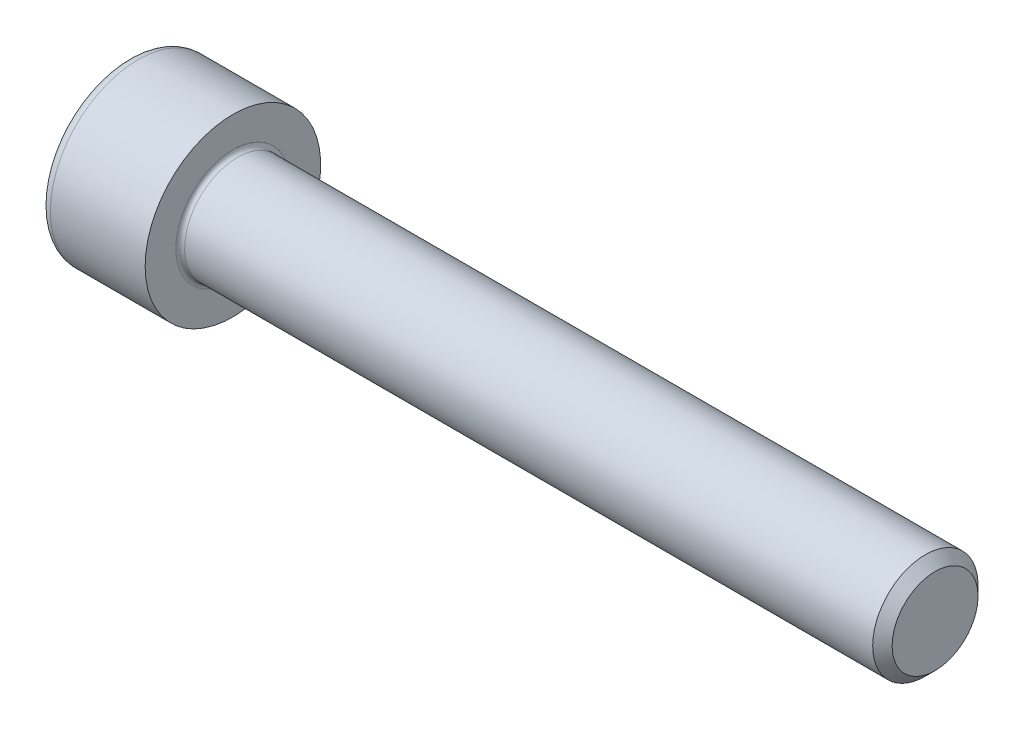
ISO-10303-21;
HEADER;
FILE_DESCRIPTION(('STEP AP214'),'2;1');
FILE_NAME('part.step','',(''),(''),'','','');
FILE_SCHEMA(('AUTOMOTIVE_DESIGN { 1 0 10303 214 1 1 1 1 }'));
ENDSEC;
DATA;
#1=APPLICATION_CONTEXT('core data for automotive mechanical design processes');
#2=APPLICATION_PROTOCOL_DEFINITION('international standard','automotive_design',2000,#1);
#3=PRODUCT_CONTEXT('',#1,'mechanical');
#4=PRODUCT('Part','Part','',(#3));
#5=PRODUCT_RELATED_PRODUCT_CATEGORY('part','',(#4));
#6=PRODUCT_DEFINITION_FORMATION('','',#4);
#7=PRODUCT_DEFINITION_CONTEXT('part definition',#1,'design');
#8=PRODUCT_DEFINITION('design','',#6,#7);
#9=PRODUCT_DEFINITION_SHAPE('','',#8);
#10=(LENGTH_UNIT() NAMED_UNIT(*) SI_UNIT(.MILLI.,.METRE.));
#11=(NAMED_UNIT(*) PLANE_ANGLE_UNIT() SI_UNIT($,.RADIAN.));
#12=(NAMED_UNIT(*) SI_UNIT($,.STERADIAN.) SOLID_ANGLE_UNIT());
#13=UNCERTAINTY_MEASURE_WITH_UNIT(LENGTH_MEASURE(1.E-05),#10,'distance_accuracy_value','');
#14=(GEOMETRIC_REPRESENTATION_CONTEXT(3) GLOBAL_UNCERTAINTY_ASSIGNED_CONTEXT((#13)) GLOBAL_UNIT_ASSIGNED_CONTEXT((#10,
#11,#12)) REPRESENTATION_CONTEXT('',''));
#15=CARTESIAN_POINT('',(0.,0.,0.));
#16=DIRECTION('',(0.,0.,1.));
#17=DIRECTION('',(1.,0.,0.));
#18=AXIS2_PLACEMENT_3D('',#15,#16,#17);
#19=CARTESIAN_POINT('',(0.,0.,0.));
#20=DIRECTION('',(-1.,0.,0.));
#21=DIRECTION('',(0.,0.,1.));
#22=AXIS2_PLACEMENT_3D('',#19,#20,#21);
#23=PLANE('',#22);
#24=DIRECTION('',(0.,-0.499999999999999,0.866025403784439));
#25=VECTOR('',#24,1.);
#26=CARTESIAN_POINT('',(0.,2.89829835133192,0.));
#27=LINE('',#26,#25);
#28=CARTESIAN_POINT('',(0.,2.89829835133192,0.));
#29=VERTEX_POINT('',#28);
#30=CARTESIAN_POINT('',(0.,1.44914917566596,2.50999999999999));
#31=VERTEX_POINT('',#30);
#32=EDGE_CURVE('E259',#29,#31,#27,.T.);
#33=ORIENTED_EDGE('',*,*,#32,.T.);
#34=DIRECTION('',(0.,1.,0.));
#35=VECTOR('',#34,1.);
#36=CARTESIAN_POINT('',(0.,-1.44914917566596,2.51));
#37=LINE('',#36,#35);
#38=CARTESIAN_POINT('',(0.,-1.44914917566596,2.51));
#39=VERTEX_POINT('',#38);
#40=EDGE_CURVE('E131',#39,#31,#37,.T.);
#41=ORIENTED_EDGE('',*,*,#40,.F.);
#42=DIRECTION('',(0.,-0.500000000000001,-0.866025403784438));
#43=VECTOR('',#42,1.);
#44=CARTESIAN_POINT('',(0.,-1.44914917566596,2.51));
#45=LINE('',#44,#43);
#46=CARTESIAN_POINT('',(0.,-2.89829835133192,0.));
#47=VERTEX_POINT('',#46);
#48=EDGE_CURVE('E262',#39,#47,#45,.T.);
#49=ORIENTED_EDGE('',*,*,#48,.T.);
#50=DIRECTION('',(0.,0.499999999999999,-0.866025403784439));
#51=VECTOR('',#50,1.);
#52=CARTESIAN_POINT('',(0.,-2.89829835133192,0.));
#53=LINE('',#52,#51);
#54=CARTESIAN_POINT('',(0.,-1.44914917566597,-2.51));
#55=VERTEX_POINT('',#54);
#56=EDGE_CURVE('E265',#47,#55,#53,.T.);
#57=ORIENTED_EDGE('',*,*,#56,.T.);
#58=DIRECTION('',(0.,-1.,0.));
#59=VECTOR('',#58,1.);
#60=CARTESIAN_POINT('',(0.,1.44914917566595,-2.51));
#61=LINE('',#60,#59);
#62=CARTESIAN_POINT('',(0.,1.44914917566595,-2.51));
#63=VERTEX_POINT('',#62);
#64=EDGE_CURVE('E268',#63,#55,#61,.T.);
#65=ORIENTED_EDGE('',*,*,#64,.F.);
#66=DIRECTION('',(0.,-0.500000000000002,-0.866025403784438));
#67=VECTOR('',#66,1.);
#68=CARTESIAN_POINT('',(0.,2.89829835133192,0.));
#69=LINE('',#68,#67);
#70=EDGE_CURVE('E126',#29,#63,#69,.T.);
#71=ORIENTED_EDGE('',*,*,#70,.F.);
#72=EDGE_LOOP('',(#33,#41,#49,#57,#65,#71));
#73=FACE_BOUND('',#72,.T.);
#74=CARTESIAN_POINT('',(0.,0.,0.));
#75=DIRECTION('',(-1.,0.,0.));
#76=DIRECTION('',(0.,0.,1.));
#77=AXIS2_PLACEMENT_3D('',#74,#75,#76);
#78=CIRCLE('',#77,4.4);
#79=CARTESIAN_POINT('',(0.,0.,4.4));
#80=VERTEX_POINT('',#79);
#81=EDGE_CURVE('E43',#80,#80,#78,.T.);
#82=ORIENTED_EDGE('',*,*,#81,.T.);
#83=EDGE_LOOP('',(#82));
#84=FACE_BOUND('',#83,.T.);
#85=ADVANCED_FACE('F35',(#73,#84),#23,.T.);
#86=CARTESIAN_POINT('',(-31.75,0.,0.));
#87=DIRECTION('',(-1.,0.,0.));
#88=DIRECTION('',(0.,0.,1.));
#89=AXIS2_PLACEMENT_3D('',#86,#87,#88);
#90=CYLINDRICAL_SURFACE('',#89,5.);
#91=CARTESIAN_POINT('',(0.600000000000003,0.,0.));
#92=DIRECTION('',(-1.,0.,0.));
#93=DIRECTION('',(0.,0.,1.));
#94=AXIS2_PLACEMENT_3D('',#91,#92,#93);
#95=CIRCLE('',#94,5.);
#96=CARTESIAN_POINT('',(0.600000000000003,0.,5.));
#97=VERTEX_POINT('',#96);
#98=EDGE_CURVE('E11',#97,#97,#95,.F.);
#99=ORIENTED_EDGE('',*,*,#98,.T.);
#100=EDGE_LOOP('',(#99));
#101=FACE_BOUND('',#100,.T.);
#102=CARTESIAN_POINT('',(6.,0.,0.));
#103=DIRECTION('',(-1.,0.,0.));
#104=DIRECTION('',(0.,0.,1.));
#105=AXIS2_PLACEMENT_3D('',#102,#103,#104);
#106=CIRCLE('',#105,5.);
#107=CARTESIAN_POINT('',(6.,0.,5.));
#108=VERTEX_POINT('',#107);
#109=EDGE_CURVE('E149',#108,#108,#106,.T.);
#110=ORIENTED_EDGE('',*,*,#109,.T.);
#111=EDGE_LOOP('',(#110));
#112=FACE_BOUND('',#111,.T.);
#113=ADVANCED_FACE('F173',(#101,#112),#90,.T.);
#114=CARTESIAN_POINT('',(6.,5.,0.));
#115=DIRECTION('',(1.,0.,0.));
#116=DIRECTION('',(0.,0.,-1.));
#117=AXIS2_PLACEMENT_3D('',#114,#115,#116);
#118=PLANE('',#117);
#119=CARTESIAN_POINT('',(6.,0.,0.));
#120=DIRECTION('',(1.,0.,0.));
#121=DIRECTION('',(0.,0.,-1.));
#122=AXIS2_PLACEMENT_3D('',#119,#120,#121);
#123=CIRCLE('',#122,3.24999999999999);
#124=CARTESIAN_POINT('',(6.,0.,-3.24999999999999));
#125=VERTEX_POINT('',#124);
#126=EDGE_CURVE('E152',#125,#125,#123,.F.);
#127=ORIENTED_EDGE('',*,*,#126,.T.);
#128=EDGE_LOOP('',(#127));
#129=FACE_BOUND('',#128,.T.);
#130=ORIENTED_EDGE('',*,*,#109,.F.);
#131=EDGE_LOOP('',(#130));
#132=FACE_BOUND('',#131,.T.);
#133=ADVANCED_FACE('F179',(#129,#132),#118,.T.);
#134=CARTESIAN_POINT('',(-31.75,0.,0.));
#135=DIRECTION('',(-1.,0.,0.));
#136=DIRECTION('',(0.,0.,1.));
#137=AXIS2_PLACEMENT_3D('',#134,#135,#136);
#138=CYLINDRICAL_SURFACE('',#137,2.99999999999999);
#139=CARTESIAN_POINT('',(6.25,0.,0.));
#140=DIRECTION('',(1.,0.,0.));
#141=DIRECTION('',(0.,0.,-1.));
#142=AXIS2_PLACEMENT_3D('',#139,#140,#141);
#143=CIRCLE('',#142,2.99999999999999);
#144=CARTESIAN_POINT('',(6.25,0.,-2.99999999999999));
#145=VERTEX_POINT('',#144);
#146=EDGE_CURVE('E155',#145,#145,#143,.T.);
#147=ORIENTED_EDGE('',*,*,#146,.T.);
#148=EDGE_LOOP('',(#147));
#149=FACE_BOUND('',#148,.T.);
#150=CARTESIAN_POINT('',(45.4455,0.,0.));
#151=DIRECTION('',(-1.,0.,0.));
#152=DIRECTION('',(0.,0.,1.));
#153=AXIS2_PLACEMENT_3D('',#150,#151,#152);
#154=CIRCLE('',#153,2.99999999999998);
#155=CARTESIAN_POINT('',(45.4455,0.,2.99999999999998));
#156=VERTEX_POINT('',#155);
#157=EDGE_CURVE('E146',#156,#156,#154,.T.);
#158=ORIENTED_EDGE('',*,*,#157,.T.);
#159=EDGE_LOOP('',(#158));
#160=FACE_BOUND('',#159,.T.);
#161=ADVANCED_FACE('F185',(#149,#160),#138,.T.);
#162=CARTESIAN_POINT('',(46.,0.,0.));
#163=DIRECTION('',(-1.,0.,0.));
#164=DIRECTION('',(0.,0.,1.));
#165=AXIS2_PLACEMENT_3D('',#162,#163,#164);
#166=CONICAL_SURFACE('',#165,2.4455,0.785398163397417);
#167=ORIENTED_EDGE('',*,*,#157,.F.);
#168=EDGE_LOOP('',(#167));
#169=FACE_BOUND('',#168,.T.);
#170=CARTESIAN_POINT('',(46.,0.,0.));
#171=DIRECTION('',(-1.,0.,0.));
#172=DIRECTION('',(0.,0.,1.));
#173=AXIS2_PLACEMENT_3D('',#170,#171,#172);
#174=CIRCLE('',#173,2.4455);
#175=CARTESIAN_POINT('',(46.,0.,2.4455));
#176=VERTEX_POINT('',#175);
#177=EDGE_CURVE('E142',#176,#176,#174,.T.);
#178=ORIENTED_EDGE('',*,*,#177,.T.);
#179=EDGE_LOOP('',(#178));
#180=FACE_BOUND('',#179,.T.);
#181=ADVANCED_FACE('F189',(#169,#180),#166,.T.);
#182=CARTESIAN_POINT('',(46.,2.4455,0.));
#183=DIRECTION('',(1.,0.,0.));
#184=DIRECTION('',(0.,0.,-1.));
#185=AXIS2_PLACEMENT_3D('',#182,#183,#184);
#186=PLANE('',#185);
#187=ORIENTED_EDGE('',*,*,#177,.F.);
#188=EDGE_LOOP('',(#187));
#189=FACE_BOUND('',#188,.T.);
#190=ADVANCED_FACE('F169',(#189),#186,.T.);
#191=CARTESIAN_POINT('',(6.25,0.,0.));
#192=DIRECTION('',(1.,0.,0.));
#193=DIRECTION('',(0.,0.,-1.));
#194=AXIS2_PLACEMENT_3D('',#191,#192,#193);
#195=TOROIDAL_SURFACE('',#194,3.24999999999999,0.25);
#196=ORIENTED_EDGE('',*,*,#146,.F.);
#197=EDGE_LOOP('',(#196));
#198=FACE_BOUND('',#197,.T.);
#199=ORIENTED_EDGE('',*,*,#126,.F.);
#200=EDGE_LOOP('',(#199));
#201=FACE_BOUND('',#200,.T.);
#202=ADVANCED_FACE('F162',(#198,#201),#195,.F.);
#203=CARTESIAN_POINT('',(0.600000000000003,0.,0.));
#204=DIRECTION('',(-1.,0.,0.));
#205=DIRECTION('',(0.,0.,1.));
#206=AXIS2_PLACEMENT_3D('',#203,#204,#205);
#207=TOROIDAL_SURFACE('',#206,4.4,0.6);
#208=ORIENTED_EDGE('',*,*,#98,.F.);
#209=EDGE_LOOP('',(#208));
#210=FACE_BOUND('',#209,.T.);
#211=ORIENTED_EDGE('',*,*,#81,.F.);
#212=EDGE_LOOP('',(#211));
#213=FACE_BOUND('',#212,.T.);
#214=ADVANCED_FACE('F37',(#210,#213),#207,.T.);
#215=CARTESIAN_POINT('',(3.,2.89829835133192,0.));
#216=DIRECTION('',(0.,-0.866025403784439,-0.499999999999999));
#217=DIRECTION('',(0.,0.499999999999999,-0.866025403784439));
#218=AXIS2_PLACEMENT_3D('',#215,#216,#217);
#219=PLANE('',#218);
#220=ORIENTED_EDGE('',*,*,#32,.F.);
#221=DIRECTION('',(-1.,0.,0.));
#222=VECTOR('',#221,1.);
#223=CARTESIAN_POINT('',(3.,2.89829835133192,0.));
#224=LINE('',#223,#222);
#225=CARTESIAN_POINT('',(3.,2.89829835133192,0.));
#226=VERTEX_POINT('',#225);
#227=EDGE_CURVE('E249',#226,#29,#224,.T.);
#228=ORIENTED_EDGE('',*,*,#227,.F.);
#229=DIRECTION('',(0.,-0.499999999999999,0.866025403784439));
#230=VECTOR('',#229,1.);
#231=CARTESIAN_POINT('',(3.,2.89829835133192,0.));
#232=LINE('',#231,#230);
#233=CARTESIAN_POINT('',(3.,2.17372376349894,1.25499999999999));
#234=VERTEX_POINT('',#233);
#235=EDGE_CURVE('E118',#226,#234,#232,.T.);
#236=ORIENTED_EDGE('',*,*,#235,.T.);
#237=CARTESIAN_POINT('',(3.,1.44914917566596,2.50999999999999));
#238=VERTEX_POINT('',#237);
#239=EDGE_CURVE('E109',#234,#238,#232,.T.);
#240=ORIENTED_EDGE('',*,*,#239,.T.);
#241=DIRECTION('',(-1.,0.,0.));
#242=VECTOR('',#241,1.);
#243=CARTESIAN_POINT('',(3.,1.44914917566596,2.50999999999999));
#244=LINE('',#243,#242);
#245=EDGE_CURVE('E123',#238,#31,#244,.T.);
#246=ORIENTED_EDGE('',*,*,#245,.T.);
#247=EDGE_LOOP('',(#220,#228,#236,#240,#246));
#248=FACE_BOUND('',#247,.T.);
#249=ADVANCED_FACE('F122',(#248),#219,.T.);
#250=CARTESIAN_POINT('',(3.,-1.44914917566596,2.51));
#251=DIRECTION('',(0.,0.,1.));
#252=DIRECTION('',(0.,-1.,0.));
#253=AXIS2_PLACEMENT_3D('',#250,#251,#252);
#254=PLANE('',#253);
#255=ORIENTED_EDGE('',*,*,#40,.T.);
#256=ORIENTED_EDGE('',*,*,#245,.F.);
#257=DIRECTION('',(0.,1.,0.));
#258=VECTOR('',#257,1.);
#259=CARTESIAN_POINT('',(3.,-1.44914917566596,2.51));
#260=LINE('',#259,#258);
#261=CARTESIAN_POINT('',(3.,0.,2.51));
#262=VERTEX_POINT('',#261);
#263=EDGE_CURVE('E106',#262,#238,#260,.T.);
#264=ORIENTED_EDGE('',*,*,#263,.F.);
#265=CARTESIAN_POINT('',(3.,-1.44914917566596,2.51));
#266=VERTEX_POINT('',#265);
#267=EDGE_CURVE('E117',#266,#262,#260,.T.);
#268=ORIENTED_EDGE('',*,*,#267,.F.);
#269=DIRECTION('',(-1.,0.,0.));
#270=VECTOR('',#269,1.);
#271=CARTESIAN_POINT('',(3.,-1.44914917566596,2.51));
#272=LINE('',#271,#270);
#273=EDGE_CURVE('E133',#266,#39,#272,.T.);
#274=ORIENTED_EDGE('',*,*,#273,.T.);
#275=EDGE_LOOP('',(#255,#256,#264,#268,#274));
#276=FACE_BOUND('',#275,.T.);
#277=ADVANCED_FACE('F128',(#276),#254,.F.);
#278=CARTESIAN_POINT('',(3.,-1.44914917566596,2.51));
#279=DIRECTION('',(0.,0.866025403784438,-0.500000000000001));
#280=DIRECTION('',(0.,0.500000000000001,0.866025403784438));
#281=AXIS2_PLACEMENT_3D('',#278,#279,#280);
#282=PLANE('',#281);
#283=ORIENTED_EDGE('',*,*,#48,.F.);
#284=ORIENTED_EDGE('',*,*,#273,.F.);
#285=DIRECTION('',(0.,-0.500000000000001,-0.866025403784438));
#286=VECTOR('',#285,1.);
#287=CARTESIAN_POINT('',(3.,-1.44914917566596,2.51));
#288=LINE('',#287,#286);
#289=CARTESIAN_POINT('',(3.,-2.17372376349894,1.255));
#290=VERTEX_POINT('',#289);
#291=EDGE_CURVE('E288',#266,#290,#288,.T.);
#292=ORIENTED_EDGE('',*,*,#291,.T.);
#293=CARTESIAN_POINT('',(3.,-2.89829835133192,0.));
#294=VERTEX_POINT('',#293);
#295=EDGE_CURVE('E277',#290,#294,#288,.T.);
#296=ORIENTED_EDGE('',*,*,#295,.T.);
#297=DIRECTION('',(-1.,0.,0.));
#298=VECTOR('',#297,1.);
#299=CARTESIAN_POINT('',(3.,-2.89829835133192,0.));
#300=LINE('',#299,#298);
#301=EDGE_CURVE('E138',#294,#47,#300,.T.);
#302=ORIENTED_EDGE('',*,*,#301,.T.);
#303=EDGE_LOOP('',(#283,#284,#292,#296,#302));
#304=FACE_BOUND('',#303,.T.);
#305=ADVANCED_FACE('F203',(#304),#282,.T.);
#306=CARTESIAN_POINT('',(3.,-2.89829835133192,0.));
#307=DIRECTION('',(0.,0.866025403784439,0.499999999999999));
#308=DIRECTION('',(0.,-0.499999999999999,0.866025403784439));
#309=AXIS2_PLACEMENT_3D('',#306,#307,#308);
#310=PLANE('',#309);
#311=ORIENTED_EDGE('',*,*,#56,.F.);
#312=ORIENTED_EDGE('',*,*,#301,.F.);
#313=DIRECTION('',(0.,0.499999999999999,-0.866025403784439));
#314=VECTOR('',#313,1.);
#315=CARTESIAN_POINT('',(3.,-2.89829835133192,0.));
#316=LINE('',#315,#314);
#317=CARTESIAN_POINT('',(3.,-2.17372376349895,-1.255));
#318=VERTEX_POINT('',#317);
#319=EDGE_CURVE('E255',#294,#318,#316,.T.);
#320=ORIENTED_EDGE('',*,*,#319,.T.);
#321=CARTESIAN_POINT('',(3.,-1.44914917566597,-2.51));
#322=VERTEX_POINT('',#321);
#323=EDGE_CURVE('E287',#318,#322,#316,.T.);
#324=ORIENTED_EDGE('',*,*,#323,.T.);
#325=DIRECTION('',(-1.,0.,0.));
#326=VECTOR('',#325,1.);
#327=CARTESIAN_POINT('',(3.,-1.44914917566597,-2.51));
#328=LINE('',#327,#326);
#329=EDGE_CURVE('E248',#322,#55,#328,.T.);
#330=ORIENTED_EDGE('',*,*,#329,.T.);
#331=EDGE_LOOP('',(#311,#312,#320,#324,#330));
#332=FACE_BOUND('',#331,.T.);
#333=ADVANCED_FACE('F206',(#332),#310,.T.);
#334=CARTESIAN_POINT('',(3.,1.44914917566595,-2.51));
#335=DIRECTION('',(0.,0.,-1.));
#336=DIRECTION('',(0.,1.,0.));
#337=AXIS2_PLACEMENT_3D('',#334,#335,#336);
#338=PLANE('',#337);
#339=ORIENTED_EDGE('',*,*,#64,.T.);
#340=ORIENTED_EDGE('',*,*,#329,.F.);
#341=DIRECTION('',(0.,-1.,0.));
#342=VECTOR('',#341,1.);
#343=CARTESIAN_POINT('',(3.,1.44914917566595,-2.51));
#344=LINE('',#343,#342);
#345=CARTESIAN_POINT('',(3.,0.,-2.51));
#346=VERTEX_POINT('',#345);
#347=EDGE_CURVE('E252',#346,#322,#344,.T.);
#348=ORIENTED_EDGE('',*,*,#347,.F.);
#349=CARTESIAN_POINT('',(3.,1.44914917566595,-2.51));
#350=VERTEX_POINT('',#349);
#351=EDGE_CURVE('E50',#350,#346,#344,.T.);
#352=ORIENTED_EDGE('',*,*,#351,.F.);
#353=DIRECTION('',(-1.,0.,0.));
#354=VECTOR('',#353,1.);
#355=CARTESIAN_POINT('',(3.,1.44914917566595,-2.51));
#356=LINE('',#355,#354);
#357=EDGE_CURVE('E245',#350,#63,#356,.T.);
#358=ORIENTED_EDGE('',*,*,#357,.T.);
#359=EDGE_LOOP('',(#339,#340,#348,#352,#358));
#360=FACE_BOUND('',#359,.T.);
#361=ADVANCED_FACE('F210',(#360),#338,.F.);
#362=CARTESIAN_POINT('',(3.,2.89829835133192,0.));
#363=DIRECTION('',(0.,0.866025403784438,-0.500000000000002));
#364=DIRECTION('',(0.,0.500000000000002,0.866025403784438));
#365=AXIS2_PLACEMENT_3D('',#362,#363,#364);
#366=PLANE('',#365);
#367=ORIENTED_EDGE('',*,*,#70,.T.);
#368=ORIENTED_EDGE('',*,*,#357,.F.);
#369=DIRECTION('',(0.,-0.500000000000002,-0.866025403784438));
#370=VECTOR('',#369,1.);
#371=CARTESIAN_POINT('',(3.,2.89829835133192,0.));
#372=LINE('',#371,#370);
#373=CARTESIAN_POINT('',(3.,2.17372376349894,-1.255));
#374=VERTEX_POINT('',#373);
#375=EDGE_CURVE('E235',#374,#350,#372,.T.);
#376=ORIENTED_EDGE('',*,*,#375,.F.);
#377=EDGE_CURVE('E241',#226,#374,#372,.T.);
#378=ORIENTED_EDGE('',*,*,#377,.F.);
#379=ORIENTED_EDGE('',*,*,#227,.T.);
#380=EDGE_LOOP('',(#367,#368,#376,#378,#379));
#381=FACE_BOUND('',#380,.T.);
#382=ADVANCED_FACE('F214',(#381),#366,.F.);
#383=CARTESIAN_POINT('',(3.,2.89829835133192,0.));
#384=DIRECTION('',(1.,0.,0.));
#385=DIRECTION('',(0.,0.,-1.));
#386=AXIS2_PLACEMENT_3D('',#383,#384,#385);
#387=PLANE('',#386);
#388=ORIENTED_EDGE('',*,*,#347,.T.);
#389=ORIENTED_EDGE('',*,*,#323,.F.);
#390=CARTESIAN_POINT('',(3.,0.,0.));
#391=DIRECTION('',(-1.,0.,0.));
#392=DIRECTION('',(0.,0.,1.));
#393=AXIS2_PLACEMENT_3D('',#390,#391,#392);
#394=CIRCLE('',#393,2.51);
#395=EDGE_CURVE('E283',#346,#318,#394,.T.);
#396=ORIENTED_EDGE('',*,*,#395,.F.);
#397=EDGE_LOOP('',(#388,#389,#396));
#398=FACE_BOUND('',#397,.T.);
#399=ADVANCED_FACE('F218',(#398),#387,.F.);
#400=ORIENTED_EDGE('',*,*,#319,.F.);
#401=ORIENTED_EDGE('',*,*,#295,.F.);
#402=EDGE_CURVE('E136',#318,#290,#394,.T.);
#403=ORIENTED_EDGE('',*,*,#402,.F.);
#404=EDGE_LOOP('',(#400,#401,#403));
#405=FACE_BOUND('',#404,.T.);
#406=ADVANCED_FACE('F221',(#405),#387,.F.);
#407=ORIENTED_EDGE('',*,*,#291,.F.);
#408=ORIENTED_EDGE('',*,*,#267,.T.);
#409=EDGE_CURVE('E132',#290,#262,#394,.T.);
#410=ORIENTED_EDGE('',*,*,#409,.F.);
#411=EDGE_LOOP('',(#407,#408,#410));
#412=FACE_BOUND('',#411,.T.);
#413=ADVANCED_FACE('F226',(#412),#387,.F.);
#414=ORIENTED_EDGE('',*,*,#263,.T.);
#415=ORIENTED_EDGE('',*,*,#239,.F.);
#416=EDGE_CURVE('E112',#262,#234,#394,.T.);
#417=ORIENTED_EDGE('',*,*,#416,.F.);
#418=EDGE_LOOP('',(#414,#415,#417));
#419=FACE_BOUND('',#418,.T.);
#420=ADVANCED_FACE('F108',(#419),#387,.F.);
#421=ORIENTED_EDGE('',*,*,#235,.F.);
#422=ORIENTED_EDGE('',*,*,#377,.T.);
#423=EDGE_CURVE('E143',#234,#374,#394,.T.);
#424=ORIENTED_EDGE('',*,*,#423,.F.);
#425=EDGE_LOOP('',(#421,#422,#424));
#426=FACE_BOUND('',#425,.T.);
#427=ADVANCED_FACE('F229',(#426),#387,.F.);
#428=ORIENTED_EDGE('',*,*,#375,.T.);
#429=ORIENTED_EDGE('',*,*,#351,.T.);
#430=EDGE_CURVE('E238',#374,#346,#394,.T.);
#431=ORIENTED_EDGE('',*,*,#430,.F.);
#432=EDGE_LOOP('',(#428,#429,#431));
#433=FACE_BOUND('',#432,.T.);
#434=ADVANCED_FACE('F199',(#433),#387,.F.);
#435=CARTESIAN_POINT('',(3.,0.,0.));
#436=DIRECTION('',(-1.,0.,0.));
#437=DIRECTION('',(0.,0.,1.));
#438=AXIS2_PLACEMENT_3D('',#435,#436,#437);
#439=CONICAL_SURFACE('',#438,2.51,1.04719755119659);
#440=CARTESIAN_POINT('',(4.44914917566598,0.,0.));
#441=VERTEX_POINT('',#440);
#442=VERTEX_LOOP('',#441);
#443=FACE_BOUND('',#442,.T.);
#444=ORIENTED_EDGE('',*,*,#416,.T.);
#445=ORIENTED_EDGE('',*,*,#423,.T.);
#446=ORIENTED_EDGE('',*,*,#430,.T.);
#447=ORIENTED_EDGE('',*,*,#395,.T.);
#448=ORIENTED_EDGE('',*,*,#402,.T.);
#449=ORIENTED_EDGE('',*,*,#409,.T.);
#450=EDGE_LOOP('',(#444,#445,#446,#447,#448,#449));
#451=FACE_BOUND('',#450,.T.);
#452=ADVANCED_FACE('F197',(#443,#451),#439,.F.);
#453=CLOSED_SHELL('',(#85,#113,#133,#161,#181,#190,#202,#214,#249,#277,#305,#333,#361,#382,#399,
#406,#413,#420,#427,#434,#452));
#454=MANIFOLD_SOLID_BREP('B2',#453);
#455=ADVANCED_BREP_SHAPE_REPRESENTATION('',(#18,#454),#14);
#456=SHAPE_DEFINITION_REPRESENTATION(#9,#455);
ENDSEC;
END-ISO-10303-21;
